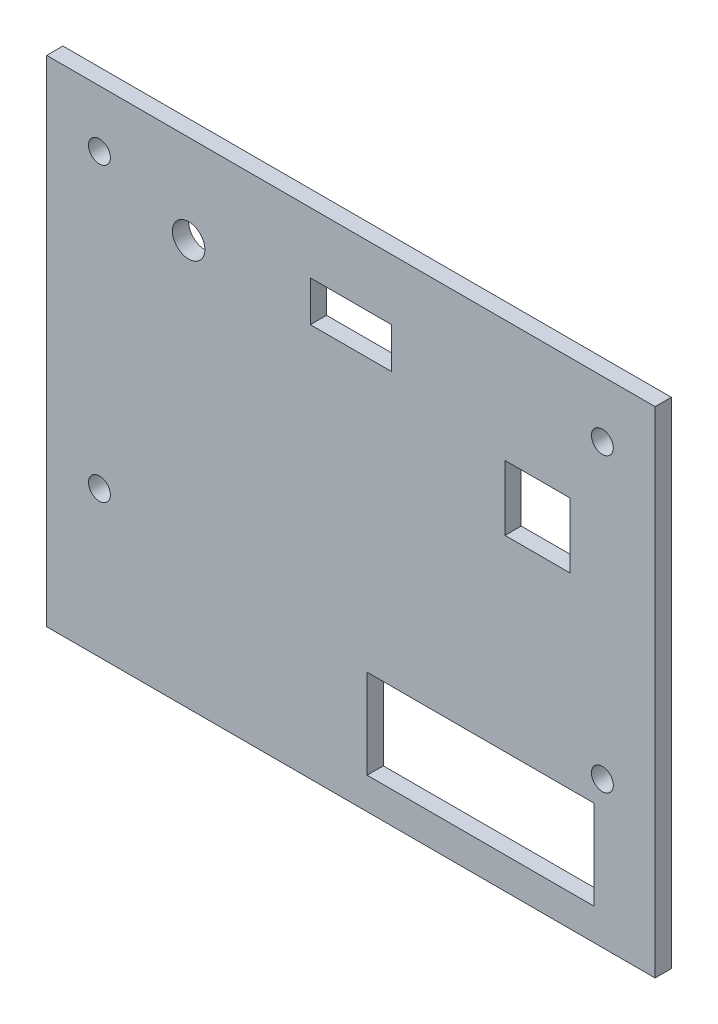
ISO-10303-21;
HEADER;
FILE_DESCRIPTION(('STEP AP214'),'2;1');
FILE_NAME('part.step','',(''),(''),'','','');
FILE_SCHEMA(('AUTOMOTIVE_DESIGN { 1 0 10303 214 1 1 1 1 }'));
ENDSEC;
DATA;
#1=APPLICATION_CONTEXT('core data for automotive mechanical design processes');
#2=APPLICATION_PROTOCOL_DEFINITION('international standard','automotive_design',2000,#1);
#3=PRODUCT_CONTEXT('',#1,'mechanical');
#4=PRODUCT('Part','Part','',(#3));
#5=PRODUCT_RELATED_PRODUCT_CATEGORY('part','',(#4));
#6=PRODUCT_DEFINITION_FORMATION('','',#4);
#7=PRODUCT_DEFINITION_CONTEXT('part definition',#1,'design');
#8=PRODUCT_DEFINITION('design','',#6,#7);
#9=PRODUCT_DEFINITION_SHAPE('','',#8);
#10=(LENGTH_UNIT() NAMED_UNIT(*) SI_UNIT(.MILLI.,.METRE.));
#11=(NAMED_UNIT(*) PLANE_ANGLE_UNIT() SI_UNIT($,.RADIAN.));
#12=(NAMED_UNIT(*) SI_UNIT($,.STERADIAN.) SOLID_ANGLE_UNIT());
#13=UNCERTAINTY_MEASURE_WITH_UNIT(LENGTH_MEASURE(1.E-05),#10,'distance_accuracy_value','');
#14=(GEOMETRIC_REPRESENTATION_CONTEXT(3) GLOBAL_UNCERTAINTY_ASSIGNED_CONTEXT((#13)) GLOBAL_UNIT_ASSIGNED_CONTEXT((#10,
#11,#12)) REPRESENTATION_CONTEXT('',''));
#15=CARTESIAN_POINT('',(0.,0.,0.));
#16=DIRECTION('',(0.,0.,1.));
#17=DIRECTION('',(1.,0.,0.));
#18=AXIS2_PLACEMENT_3D('',#15,#16,#17);
#19=CARTESIAN_POINT('',(0.,0.,2.));
#20=DIRECTION('',(0.,0.,-1.));
#21=DIRECTION('',(-1.,0.,0.));
#22=AXIS2_PLACEMENT_3D('',#19,#20,#21);
#23=PLANE('',#22);
#24=CARTESIAN_POINT('',(17.5,50.,2.));
#25=DIRECTION('',(0.,0.,1.));
#26=DIRECTION('',(1.,0.,0.));
#27=AXIS2_PLACEMENT_3D('',#24,#25,#26);
#28=CIRCLE('',#27,2.);
#29=CARTESIAN_POINT('',(19.5,50.,2.));
#30=VERTEX_POINT('',#29);
#31=EDGE_CURVE('E399',#30,#30,#28,.T.);
#32=ORIENTED_EDGE('',*,*,#31,.F.);
#33=EDGE_LOOP('',(#32));
#34=FACE_BOUND('',#33,.T.);
#35=CARTESIAN_POINT('',(68.5,18.,2.));
#36=DIRECTION('',(0.,0.,1.));
#37=DIRECTION('',(1.,0.,0.));
#38=AXIS2_PLACEMENT_3D('',#35,#36,#37);
#39=CIRCLE('',#38,1.35000000000001);
#40=CARTESIAN_POINT('',(69.85,18.,2.));
#41=VERTEX_POINT('',#40);
#42=EDGE_CURVE('E417',#41,#41,#39,.T.);
#43=ORIENTED_EDGE('',*,*,#42,.F.);
#44=EDGE_LOOP('',(#43));
#45=FACE_BOUND('',#44,.T.);
#46=CARTESIAN_POINT('',(6.5,54.,2.));
#47=DIRECTION('',(0.,0.,1.));
#48=DIRECTION('',(1.,0.,0.));
#49=AXIS2_PLACEMENT_3D('',#46,#47,#48);
#50=CIRCLE('',#49,1.35);
#51=CARTESIAN_POINT('',(7.85,54.,2.));
#52=VERTEX_POINT('',#51);
#53=EDGE_CURVE('E410',#52,#52,#50,.T.);
#54=ORIENTED_EDGE('',*,*,#53,.F.);
#55=EDGE_LOOP('',(#54));
#56=FACE_BOUND('',#55,.T.);
#57=CARTESIAN_POINT('',(68.5,54.,2.));
#58=DIRECTION('',(0.,0.,1.));
#59=DIRECTION('',(1.,0.,0.));
#60=AXIS2_PLACEMENT_3D('',#57,#58,#59);
#61=CIRCLE('',#60,1.35000000000001);
#62=CARTESIAN_POINT('',(69.85,54.,2.));
#63=VERTEX_POINT('',#62);
#64=EDGE_CURVE('E404',#63,#63,#61,.T.);
#65=ORIENTED_EDGE('',*,*,#64,.F.);
#66=EDGE_LOOP('',(#65));
#67=FACE_BOUND('',#66,.T.);
#68=CARTESIAN_POINT('',(6.5,18.,2.));
#69=DIRECTION('',(0.,0.,1.));
#70=DIRECTION('',(1.,0.,0.));
#71=AXIS2_PLACEMENT_3D('',#68,#69,#70);
#72=CIRCLE('',#71,1.35);
#73=CARTESIAN_POINT('',(7.85,18.,2.));
#74=VERTEX_POINT('',#73);
#75=EDGE_CURVE('E198',#74,#74,#72,.T.);
#76=ORIENTED_EDGE('',*,*,#75,.F.);
#77=EDGE_LOOP('',(#76));
#78=FACE_BOUND('',#77,.T.);
#79=DIRECTION('',(0.,-1.,0.));
#80=VECTOR('',#79,1.);
#81=CARTESIAN_POINT('',(56.5,38.,2.));
#82=LINE('',#81,#80);
#83=CARTESIAN_POINT('',(56.5,46.,2.));
#84=VERTEX_POINT('',#83);
#85=CARTESIAN_POINT('',(56.5,38.,2.));
#86=VERTEX_POINT('',#85);
#87=EDGE_CURVE('E209',#84,#86,#82,.T.);
#88=ORIENTED_EDGE('',*,*,#87,.F.);
#89=DIRECTION('',(-1.,0.,0.));
#90=VECTOR('',#89,1.);
#91=CARTESIAN_POINT('',(56.5,46.,2.));
#92=LINE('',#91,#90);
#93=CARTESIAN_POINT('',(64.5,46.,2.));
#94=VERTEX_POINT('',#93);
#95=EDGE_CURVE('E204',#94,#84,#92,.T.);
#96=ORIENTED_EDGE('',*,*,#95,.F.);
#97=DIRECTION('',(0.,1.,0.));
#98=VECTOR('',#97,1.);
#99=CARTESIAN_POINT('',(64.5,38.,2.));
#100=LINE('',#99,#98);
#101=CARTESIAN_POINT('',(64.5,38.,2.));
#102=VERTEX_POINT('',#101);
#103=EDGE_CURVE('E218',#102,#94,#100,.T.);
#104=ORIENTED_EDGE('',*,*,#103,.F.);
#105=DIRECTION('',(1.,0.,0.));
#106=VECTOR('',#105,1.);
#107=CARTESIAN_POINT('',(56.5,38.,2.));
#108=LINE('',#107,#106);
#109=EDGE_CURVE('E220',#86,#102,#108,.T.);
#110=ORIENTED_EDGE('',*,*,#109,.F.);
#111=EDGE_LOOP('',(#88,#96,#104,#110));
#112=FACE_BOUND('',#111,.T.);
#113=DIRECTION('',(0.,-1.,0.));
#114=VECTOR('',#113,1.);
#115=CARTESIAN_POINT('',(0.,0.,2.));
#116=LINE('',#115,#114);
#117=CARTESIAN_POINT('',(0.,61.,2.));
#118=VERTEX_POINT('',#117);
#119=CARTESIAN_POINT('',(0.,0.,2.));
#120=VERTEX_POINT('',#119);
#121=EDGE_CURVE('E254',#118,#120,#116,.T.);
#122=ORIENTED_EDGE('',*,*,#121,.T.);
#123=DIRECTION('',(1.,0.,0.));
#124=VECTOR('',#123,1.);
#125=CARTESIAN_POINT('',(0.,0.,2.));
#126=LINE('',#125,#124);
#127=CARTESIAN_POINT('',(75.,0.,2.));
#128=VERTEX_POINT('',#127);
#129=EDGE_CURVE('E257',#120,#128,#126,.T.);
#130=ORIENTED_EDGE('',*,*,#129,.T.);
#131=DIRECTION('',(0.,1.,0.));
#132=VECTOR('',#131,1.);
#133=CARTESIAN_POINT('',(75.,0.,2.));
#134=LINE('',#133,#132);
#135=CARTESIAN_POINT('',(75.,61.,2.));
#136=VERTEX_POINT('',#135);
#137=EDGE_CURVE('E260',#128,#136,#134,.T.);
#138=ORIENTED_EDGE('',*,*,#137,.T.);
#139=DIRECTION('',(-1.,0.,0.));
#140=VECTOR('',#139,1.);
#141=CARTESIAN_POINT('',(0.,61.,2.));
#142=LINE('',#141,#140);
#143=EDGE_CURVE('E262',#136,#118,#142,.T.);
#144=ORIENTED_EDGE('',*,*,#143,.T.);
#145=EDGE_LOOP('',(#122,#130,#138,#144));
#146=FACE_BOUND('',#145,.T.);
#147=DIRECTION('',(0.,-1.,0.));
#148=VECTOR('',#147,1.);
#149=CARTESIAN_POINT('',(39.5,3.9,2.));
#150=LINE('',#149,#148);
#151=CARTESIAN_POINT('',(39.5,14.9,2.));
#152=VERTEX_POINT('',#151);
#153=CARTESIAN_POINT('',(39.5,3.9,2.));
#154=VERTEX_POINT('',#153);
#155=EDGE_CURVE('E223',#152,#154,#150,.T.);
#156=ORIENTED_EDGE('',*,*,#155,.F.);
#157=DIRECTION('',(-1.,0.,0.));
#158=VECTOR('',#157,1.);
#159=CARTESIAN_POINT('',(39.5,14.9,2.));
#160=LINE('',#159,#158);
#161=CARTESIAN_POINT('',(67.5,14.9,2.));
#162=VERTEX_POINT('',#161);
#163=EDGE_CURVE('E231',#162,#152,#160,.T.);
#164=ORIENTED_EDGE('',*,*,#163,.F.);
#165=DIRECTION('',(0.,1.,0.));
#166=VECTOR('',#165,1.);
#167=CARTESIAN_POINT('',(67.5,3.9,2.));
#168=LINE('',#167,#166);
#169=CARTESIAN_POINT('',(67.5,3.9,2.));
#170=VERTEX_POINT('',#169);
#171=EDGE_CURVE('E228',#170,#162,#168,.T.);
#172=ORIENTED_EDGE('',*,*,#171,.F.);
#173=DIRECTION('',(1.,0.,0.));
#174=VECTOR('',#173,1.);
#175=CARTESIAN_POINT('',(39.5,3.9,2.));
#176=LINE('',#175,#174);
#177=EDGE_CURVE('E225',#154,#170,#176,.T.);
#178=ORIENTED_EDGE('',*,*,#177,.F.);
#179=EDGE_LOOP('',(#156,#164,#172,#178));
#180=FACE_BOUND('',#179,.T.);
#181=DIRECTION('',(0.,-1.,0.));
#182=VECTOR('',#181,1.);
#183=CARTESIAN_POINT('',(32.5,48.5,2.));
#184=LINE('',#183,#182);
#185=CARTESIAN_POINT('',(32.5,53.5,2.));
#186=VERTEX_POINT('',#185);
#187=CARTESIAN_POINT('',(32.5,48.5,2.));
#188=VERTEX_POINT('',#187);
#189=EDGE_CURVE('E153',#186,#188,#184,.T.);
#190=ORIENTED_EDGE('',*,*,#189,.F.);
#191=DIRECTION('',(-1.,0.,0.));
#192=VECTOR('',#191,1.);
#193=CARTESIAN_POINT('',(32.5,53.5,2.));
#194=LINE('',#193,#192);
#195=CARTESIAN_POINT('',(42.5,53.5,2.));
#196=VERTEX_POINT('',#195);
#197=EDGE_CURVE('E177',#196,#186,#194,.T.);
#198=ORIENTED_EDGE('',*,*,#197,.F.);
#199=DIRECTION('',(0.,1.,0.));
#200=VECTOR('',#199,1.);
#201=CARTESIAN_POINT('',(42.5,48.5,2.));
#202=LINE('',#201,#200);
#203=CARTESIAN_POINT('',(42.5,48.5,2.));
#204=VERTEX_POINT('',#203);
#205=EDGE_CURVE('E175',#204,#196,#202,.T.);
#206=ORIENTED_EDGE('',*,*,#205,.F.);
#207=DIRECTION('',(1.,0.,0.));
#208=VECTOR('',#207,1.);
#209=CARTESIAN_POINT('',(32.5,48.5,2.));
#210=LINE('',#209,#208);
#211=EDGE_CURVE('E163',#188,#204,#210,.T.);
#212=ORIENTED_EDGE('',*,*,#211,.F.);
#213=EDGE_LOOP('',(#190,#198,#206,#212));
#214=FACE_BOUND('',#213,.T.);
#215=ADVANCED_FACE('F39',(#34,#45,#56,#67,#78,#112,#146,#180,#214),#23,.F.);
#216=CARTESIAN_POINT('',(0.,0.,0.));
#217=DIRECTION('',(0.,0.,-1.));
#218=DIRECTION('',(-1.,0.,0.));
#219=AXIS2_PLACEMENT_3D('',#216,#217,#218);
#220=PLANE('',#219);
#221=CARTESIAN_POINT('',(17.5,50.,0.));
#222=DIRECTION('',(0.,0.,1.));
#223=DIRECTION('',(1.,0.,0.));
#224=AXIS2_PLACEMENT_3D('',#221,#222,#223);
#225=CIRCLE('',#224,2.);
#226=CARTESIAN_POINT('',(19.5,50.,0.));
#227=VERTEX_POINT('',#226);
#228=EDGE_CURVE('E402',#227,#227,#225,.T.);
#229=ORIENTED_EDGE('',*,*,#228,.T.);
#230=EDGE_LOOP('',(#229));
#231=FACE_BOUND('',#230,.T.);
#232=CARTESIAN_POINT('',(68.5,18.,0.));
#233=DIRECTION('',(0.,0.,1.));
#234=DIRECTION('',(1.,0.,0.));
#235=AXIS2_PLACEMENT_3D('',#232,#233,#234);
#236=CIRCLE('',#235,1.35000000000001);
#237=CARTESIAN_POINT('',(69.85,18.,0.));
#238=VERTEX_POINT('',#237);
#239=EDGE_CURVE('E413',#238,#238,#236,.T.);
#240=ORIENTED_EDGE('',*,*,#239,.T.);
#241=EDGE_LOOP('',(#240));
#242=FACE_BOUND('',#241,.T.);
#243=CARTESIAN_POINT('',(6.5,54.,0.));
#244=DIRECTION('',(0.,0.,1.));
#245=DIRECTION('',(1.,0.,0.));
#246=AXIS2_PLACEMENT_3D('',#243,#244,#245);
#247=CIRCLE('',#246,1.35);
#248=CARTESIAN_POINT('',(7.85,54.,0.));
#249=VERTEX_POINT('',#248);
#250=EDGE_CURVE('E420',#249,#249,#247,.T.);
#251=ORIENTED_EDGE('',*,*,#250,.T.);
#252=EDGE_LOOP('',(#251));
#253=FACE_BOUND('',#252,.T.);
#254=CARTESIAN_POINT('',(68.5,54.,0.));
#255=DIRECTION('',(0.,0.,1.));
#256=DIRECTION('',(1.,0.,0.));
#257=AXIS2_PLACEMENT_3D('',#254,#255,#256);
#258=CIRCLE('',#257,1.35000000000001);
#259=CARTESIAN_POINT('',(69.85,54.,0.));
#260=VERTEX_POINT('',#259);
#261=EDGE_CURVE('E407',#260,#260,#258,.T.);
#262=ORIENTED_EDGE('',*,*,#261,.T.);
#263=EDGE_LOOP('',(#262));
#264=FACE_BOUND('',#263,.T.);
#265=CARTESIAN_POINT('',(6.5,18.,0.));
#266=DIRECTION('',(0.,0.,1.));
#267=DIRECTION('',(1.,0.,0.));
#268=AXIS2_PLACEMENT_3D('',#265,#266,#267);
#269=CIRCLE('',#268,1.35);
#270=CARTESIAN_POINT('',(7.85,18.,0.));
#271=VERTEX_POINT('',#270);
#272=EDGE_CURVE('E416',#271,#271,#269,.T.);
#273=ORIENTED_EDGE('',*,*,#272,.T.);
#274=EDGE_LOOP('',(#273));
#275=FACE_BOUND('',#274,.T.);
#276=DIRECTION('',(0.,-1.,0.));
#277=VECTOR('',#276,1.);
#278=CARTESIAN_POINT('',(0.,0.,0.));
#279=LINE('',#278,#277);
#280=CARTESIAN_POINT('',(0.,61.,0.));
#281=VERTEX_POINT('',#280);
#282=CARTESIAN_POINT('',(0.,0.,0.));
#283=VERTEX_POINT('',#282);
#284=EDGE_CURVE('E253',#281,#283,#279,.T.);
#285=ORIENTED_EDGE('',*,*,#284,.F.);
#286=DIRECTION('',(-1.,0.,0.));
#287=VECTOR('',#286,1.);
#288=CARTESIAN_POINT('',(0.,61.,0.));
#289=LINE('',#288,#287);
#290=CARTESIAN_POINT('',(75.,61.,0.));
#291=VERTEX_POINT('',#290);
#292=EDGE_CURVE('E258',#291,#281,#289,.T.);
#293=ORIENTED_EDGE('',*,*,#292,.F.);
#294=DIRECTION('',(0.,1.,0.));
#295=VECTOR('',#294,1.);
#296=CARTESIAN_POINT('',(75.,0.,0.));
#297=LINE('',#296,#295);
#298=CARTESIAN_POINT('',(75.,0.,0.));
#299=VERTEX_POINT('',#298);
#300=EDGE_CURVE('E269',#299,#291,#297,.T.);
#301=ORIENTED_EDGE('',*,*,#300,.F.);
#302=DIRECTION('',(1.,0.,0.));
#303=VECTOR('',#302,1.);
#304=CARTESIAN_POINT('',(0.,0.,0.));
#305=LINE('',#304,#303);
#306=EDGE_CURVE('E267',#283,#299,#305,.T.);
#307=ORIENTED_EDGE('',*,*,#306,.F.);
#308=EDGE_LOOP('',(#285,#293,#301,#307));
#309=FACE_BOUND('',#308,.T.);
#310=DIRECTION('',(-1.,0.,0.));
#311=VECTOR('',#310,1.);
#312=CARTESIAN_POINT('',(39.5,14.9,0.));
#313=LINE('',#312,#311);
#314=CARTESIAN_POINT('',(67.5,14.9,0.));
#315=VERTEX_POINT('',#314);
#316=CARTESIAN_POINT('',(39.5,14.9,0.));
#317=VERTEX_POINT('',#316);
#318=EDGE_CURVE('E226',#315,#317,#313,.T.);
#319=ORIENTED_EDGE('',*,*,#318,.T.);
#320=DIRECTION('',(0.,-1.,0.));
#321=VECTOR('',#320,1.);
#322=CARTESIAN_POINT('',(39.5,3.9,0.));
#323=LINE('',#322,#321);
#324=CARTESIAN_POINT('',(39.5,3.9,0.));
#325=VERTEX_POINT('',#324);
#326=EDGE_CURVE('E171',#317,#325,#323,.T.);
#327=ORIENTED_EDGE('',*,*,#326,.T.);
#328=DIRECTION('',(1.,0.,0.));
#329=VECTOR('',#328,1.);
#330=CARTESIAN_POINT('',(39.5,3.9,0.));
#331=LINE('',#330,#329);
#332=CARTESIAN_POINT('',(67.5,3.9,0.));
#333=VERTEX_POINT('',#332);
#334=EDGE_CURVE('E236',#325,#333,#331,.T.);
#335=ORIENTED_EDGE('',*,*,#334,.T.);
#336=DIRECTION('',(0.,1.,0.));
#337=VECTOR('',#336,1.);
#338=CARTESIAN_POINT('',(67.5,3.9,0.));
#339=LINE('',#338,#337);
#340=EDGE_CURVE('E239',#333,#315,#339,.T.);
#341=ORIENTED_EDGE('',*,*,#340,.T.);
#342=EDGE_LOOP('',(#319,#327,#335,#341));
#343=FACE_BOUND('',#342,.T.);
#344=DIRECTION('',(-1.,0.,0.));
#345=VECTOR('',#344,1.);
#346=CARTESIAN_POINT('',(56.5,46.,0.));
#347=LINE('',#346,#345);
#348=CARTESIAN_POINT('',(64.5,46.,0.));
#349=VERTEX_POINT('',#348);
#350=CARTESIAN_POINT('',(56.5,46.,0.));
#351=VERTEX_POINT('',#350);
#352=EDGE_CURVE('E205',#349,#351,#347,.T.);
#353=ORIENTED_EDGE('',*,*,#352,.T.);
#354=DIRECTION('',(0.,-1.,0.));
#355=VECTOR('',#354,1.);
#356=CARTESIAN_POINT('',(56.5,38.,0.));
#357=LINE('',#356,#355);
#358=CARTESIAN_POINT('',(56.5,38.,0.));
#359=VERTEX_POINT('',#358);
#360=EDGE_CURVE('E184',#351,#359,#357,.T.);
#361=ORIENTED_EDGE('',*,*,#360,.T.);
#362=DIRECTION('',(1.,0.,0.));
#363=VECTOR('',#362,1.);
#364=CARTESIAN_POINT('',(56.5,38.,0.));
#365=LINE('',#364,#363);
#366=CARTESIAN_POINT('',(64.5,38.,0.));
#367=VERTEX_POINT('',#366);
#368=EDGE_CURVE('E212',#359,#367,#365,.T.);
#369=ORIENTED_EDGE('',*,*,#368,.T.);
#370=DIRECTION('',(0.,1.,0.));
#371=VECTOR('',#370,1.);
#372=CARTESIAN_POINT('',(64.5,38.,0.));
#373=LINE('',#372,#371);
#374=EDGE_CURVE('E208',#367,#349,#373,.T.);
#375=ORIENTED_EDGE('',*,*,#374,.T.);
#376=EDGE_LOOP('',(#353,#361,#369,#375));
#377=FACE_BOUND('',#376,.T.);
#378=DIRECTION('',(-1.,0.,0.));
#379=VECTOR('',#378,1.);
#380=CARTESIAN_POINT('',(32.5,53.5,0.));
#381=LINE('',#380,#379);
#382=CARTESIAN_POINT('',(42.5,53.5,0.));
#383=VERTEX_POINT('',#382);
#384=CARTESIAN_POINT('',(32.5,53.5,0.));
#385=VERTEX_POINT('',#384);
#386=EDGE_CURVE('E164',#383,#385,#381,.T.);
#387=ORIENTED_EDGE('',*,*,#386,.T.);
#388=DIRECTION('',(0.,-1.,0.));
#389=VECTOR('',#388,1.);
#390=CARTESIAN_POINT('',(32.5,48.5,0.));
#391=LINE('',#390,#389);
#392=CARTESIAN_POINT('',(32.5,48.5,0.));
#393=VERTEX_POINT('',#392);
#394=EDGE_CURVE('E182',#385,#393,#391,.T.);
#395=ORIENTED_EDGE('',*,*,#394,.T.);
#396=DIRECTION('',(1.,0.,0.));
#397=VECTOR('',#396,1.);
#398=CARTESIAN_POINT('',(32.5,48.5,0.));
#399=LINE('',#398,#397);
#400=CARTESIAN_POINT('',(42.5,48.5,0.));
#401=VERTEX_POINT('',#400);
#402=EDGE_CURVE('E170',#393,#401,#399,.T.);
#403=ORIENTED_EDGE('',*,*,#402,.T.);
#404=DIRECTION('',(0.,1.,0.));
#405=VECTOR('',#404,1.);
#406=CARTESIAN_POINT('',(42.5,48.5,0.));
#407=LINE('',#406,#405);
#408=EDGE_CURVE('E186',#401,#383,#407,.T.);
#409=ORIENTED_EDGE('',*,*,#408,.T.);
#410=EDGE_LOOP('',(#387,#395,#403,#409));
#411=FACE_BOUND('',#410,.T.);
#412=ADVANCED_FACE('F287',(#231,#242,#253,#264,#275,#309,#343,#377,#411),#220,.T.);
#413=CARTESIAN_POINT('',(0.,0.,2.));
#414=DIRECTION('',(1.,0.,0.));
#415=DIRECTION('',(0.,0.,-1.));
#416=AXIS2_PLACEMENT_3D('',#413,#414,#415);
#417=PLANE('',#416);
#418=ORIENTED_EDGE('',*,*,#284,.T.);
#419=DIRECTION('',(0.,0.,-1.));
#420=VECTOR('',#419,1.);
#421=CARTESIAN_POINT('',(0.,0.,2.));
#422=LINE('',#421,#420);
#423=EDGE_CURVE('E11',#120,#283,#422,.T.);
#424=ORIENTED_EDGE('',*,*,#423,.F.);
#425=ORIENTED_EDGE('',*,*,#121,.F.);
#426=DIRECTION('',(0.,0.,-1.));
#427=VECTOR('',#426,1.);
#428=CARTESIAN_POINT('',(0.,61.,2.));
#429=LINE('',#428,#427);
#430=EDGE_CURVE('E264',#118,#281,#429,.T.);
#431=ORIENTED_EDGE('',*,*,#430,.T.);
#432=EDGE_LOOP('',(#418,#424,#425,#431));
#433=FACE_BOUND('',#432,.T.);
#434=ADVANCED_FACE('F41',(#433),#417,.F.);
#435=CARTESIAN_POINT('',(0.,0.,2.));
#436=DIRECTION('',(0.,1.,0.));
#437=DIRECTION('',(0.,0.,1.));
#438=AXIS2_PLACEMENT_3D('',#435,#436,#437);
#439=PLANE('',#438);
#440=ORIENTED_EDGE('',*,*,#306,.T.);
#441=DIRECTION('',(0.,0.,-1.));
#442=VECTOR('',#441,1.);
#443=CARTESIAN_POINT('',(75.,0.,2.));
#444=LINE('',#443,#442);
#445=EDGE_CURVE('E47',#128,#299,#444,.T.);
#446=ORIENTED_EDGE('',*,*,#445,.F.);
#447=ORIENTED_EDGE('',*,*,#129,.F.);
#448=ORIENTED_EDGE('',*,*,#423,.T.);
#449=EDGE_LOOP('',(#440,#446,#447,#448));
#450=FACE_BOUND('',#449,.T.);
#451=ADVANCED_FACE('F298',(#450),#439,.F.);
#452=CARTESIAN_POINT('',(75.,0.,2.));
#453=DIRECTION('',(-1.,0.,0.));
#454=DIRECTION('',(0.,0.,1.));
#455=AXIS2_PLACEMENT_3D('',#452,#453,#454);
#456=PLANE('',#455);
#457=ORIENTED_EDGE('',*,*,#300,.T.);
#458=DIRECTION('',(0.,0.,-1.));
#459=VECTOR('',#458,1.);
#460=CARTESIAN_POINT('',(75.,61.,2.));
#461=LINE('',#460,#459);
#462=EDGE_CURVE('E274',#136,#291,#461,.T.);
#463=ORIENTED_EDGE('',*,*,#462,.F.);
#464=ORIENTED_EDGE('',*,*,#137,.F.);
#465=ORIENTED_EDGE('',*,*,#445,.T.);
#466=EDGE_LOOP('',(#457,#463,#464,#465));
#467=FACE_BOUND('',#466,.T.);
#468=ADVANCED_FACE('F281',(#467),#456,.F.);
#469=CARTESIAN_POINT('',(0.,61.,2.));
#470=DIRECTION('',(0.,-1.,0.));
#471=DIRECTION('',(0.,0.,-1.));
#472=AXIS2_PLACEMENT_3D('',#469,#470,#471);
#473=PLANE('',#472);
#474=ORIENTED_EDGE('',*,*,#292,.T.);
#475=ORIENTED_EDGE('',*,*,#430,.F.);
#476=ORIENTED_EDGE('',*,*,#143,.F.);
#477=ORIENTED_EDGE('',*,*,#462,.T.);
#478=EDGE_LOOP('',(#474,#475,#476,#477));
#479=FACE_BOUND('',#478,.T.);
#480=ADVANCED_FACE('F291',(#479),#473,.F.);
#481=CARTESIAN_POINT('',(39.5,3.9,2.));
#482=DIRECTION('',(1.,0.,0.));
#483=DIRECTION('',(0.,0.,-1.));
#484=AXIS2_PLACEMENT_3D('',#481,#482,#483);
#485=PLANE('',#484);
#486=ORIENTED_EDGE('',*,*,#326,.F.);
#487=DIRECTION('',(0.,0.,-1.));
#488=VECTOR('',#487,1.);
#489=CARTESIAN_POINT('',(39.5,14.9,2.));
#490=LINE('',#489,#488);
#491=EDGE_CURVE('E233',#152,#317,#490,.T.);
#492=ORIENTED_EDGE('',*,*,#491,.F.);
#493=ORIENTED_EDGE('',*,*,#155,.T.);
#494=DIRECTION('',(0.,0.,-1.));
#495=VECTOR('',#494,1.);
#496=CARTESIAN_POINT('',(39.5,3.9,2.));
#497=LINE('',#496,#495);
#498=EDGE_CURVE('E250',#154,#325,#497,.T.);
#499=ORIENTED_EDGE('',*,*,#498,.T.);
#500=EDGE_LOOP('',(#486,#492,#493,#499));
#501=FACE_BOUND('',#500,.T.);
#502=ADVANCED_FACE('F316',(#501),#485,.T.);
#503=CARTESIAN_POINT('',(39.5,3.9,2.));
#504=DIRECTION('',(0.,1.,0.));
#505=DIRECTION('',(0.,0.,1.));
#506=AXIS2_PLACEMENT_3D('',#503,#504,#505);
#507=PLANE('',#506);
#508=ORIENTED_EDGE('',*,*,#334,.F.);
#509=ORIENTED_EDGE('',*,*,#498,.F.);
#510=ORIENTED_EDGE('',*,*,#177,.T.);
#511=DIRECTION('',(0.,0.,-1.));
#512=VECTOR('',#511,1.);
#513=CARTESIAN_POINT('',(67.5,3.9,2.));
#514=LINE('',#513,#512);
#515=EDGE_CURVE('E248',#170,#333,#514,.T.);
#516=ORIENTED_EDGE('',*,*,#515,.T.);
#517=EDGE_LOOP('',(#508,#509,#510,#516));
#518=FACE_BOUND('',#517,.T.);
#519=ADVANCED_FACE('F323',(#518),#507,.T.);
#520=CARTESIAN_POINT('',(67.5,3.9,2.));
#521=DIRECTION('',(-1.,0.,0.));
#522=DIRECTION('',(0.,0.,1.));
#523=AXIS2_PLACEMENT_3D('',#520,#521,#522);
#524=PLANE('',#523);
#525=ORIENTED_EDGE('',*,*,#340,.F.);
#526=ORIENTED_EDGE('',*,*,#515,.F.);
#527=ORIENTED_EDGE('',*,*,#171,.T.);
#528=DIRECTION('',(0.,0.,-1.));
#529=VECTOR('',#528,1.);
#530=CARTESIAN_POINT('',(67.5,14.9,2.));
#531=LINE('',#530,#529);
#532=EDGE_CURVE('E246',#162,#315,#531,.T.);
#533=ORIENTED_EDGE('',*,*,#532,.T.);
#534=EDGE_LOOP('',(#525,#526,#527,#533));
#535=FACE_BOUND('',#534,.T.);
#536=ADVANCED_FACE('F328',(#535),#524,.T.);
#537=CARTESIAN_POINT('',(39.5,14.9,2.));
#538=DIRECTION('',(0.,-1.,0.));
#539=DIRECTION('',(0.,0.,-1.));
#540=AXIS2_PLACEMENT_3D('',#537,#538,#539);
#541=PLANE('',#540);
#542=ORIENTED_EDGE('',*,*,#318,.F.);
#543=ORIENTED_EDGE('',*,*,#532,.F.);
#544=ORIENTED_EDGE('',*,*,#163,.T.);
#545=ORIENTED_EDGE('',*,*,#491,.T.);
#546=EDGE_LOOP('',(#542,#543,#544,#545));
#547=FACE_BOUND('',#546,.T.);
#548=ADVANCED_FACE('F335',(#547),#541,.T.);
#549=CARTESIAN_POINT('',(56.5,38.,2.));
#550=DIRECTION('',(1.,0.,0.));
#551=DIRECTION('',(0.,0.,-1.));
#552=AXIS2_PLACEMENT_3D('',#549,#550,#551);
#553=PLANE('',#552);
#554=ORIENTED_EDGE('',*,*,#360,.F.);
#555=DIRECTION('',(0.,0.,-1.));
#556=VECTOR('',#555,1.);
#557=CARTESIAN_POINT('',(56.5,46.,2.));
#558=LINE('',#557,#556);
#559=EDGE_CURVE('E201',#84,#351,#558,.T.);
#560=ORIENTED_EDGE('',*,*,#559,.F.);
#561=ORIENTED_EDGE('',*,*,#87,.T.);
#562=DIRECTION('',(0.,0.,-1.));
#563=VECTOR('',#562,1.);
#564=CARTESIAN_POINT('',(56.5,38.,2.));
#565=LINE('',#564,#563);
#566=EDGE_CURVE('E194',#86,#359,#565,.T.);
#567=ORIENTED_EDGE('',*,*,#566,.T.);
#568=EDGE_LOOP('',(#554,#560,#561,#567));
#569=FACE_BOUND('',#568,.T.);
#570=ADVANCED_FACE('F348',(#569),#553,.T.);
#571=CARTESIAN_POINT('',(56.5,38.,2.));
#572=DIRECTION('',(0.,1.,0.));
#573=DIRECTION('',(0.,0.,1.));
#574=AXIS2_PLACEMENT_3D('',#571,#572,#573);
#575=PLANE('',#574);
#576=ORIENTED_EDGE('',*,*,#368,.F.);
#577=ORIENTED_EDGE('',*,*,#566,.F.);
#578=ORIENTED_EDGE('',*,*,#109,.T.);
#579=DIRECTION('',(0.,0.,-1.));
#580=VECTOR('',#579,1.);
#581=CARTESIAN_POINT('',(64.5,38.,2.));
#582=LINE('',#581,#580);
#583=EDGE_CURVE('E197',#102,#367,#582,.T.);
#584=ORIENTED_EDGE('',*,*,#583,.T.);
#585=EDGE_LOOP('',(#576,#577,#578,#584));
#586=FACE_BOUND('',#585,.T.);
#587=ADVANCED_FACE('F357',(#586),#575,.T.);
#588=CARTESIAN_POINT('',(64.5,38.,2.));
#589=DIRECTION('',(-1.,0.,0.));
#590=DIRECTION('',(0.,0.,1.));
#591=AXIS2_PLACEMENT_3D('',#588,#589,#590);
#592=PLANE('',#591);
#593=ORIENTED_EDGE('',*,*,#374,.F.);
#594=ORIENTED_EDGE('',*,*,#583,.F.);
#595=ORIENTED_EDGE('',*,*,#103,.T.);
#596=DIRECTION('',(0.,0.,-1.));
#597=VECTOR('',#596,1.);
#598=CARTESIAN_POINT('',(64.5,46.,2.));
#599=LINE('',#598,#597);
#600=EDGE_CURVE('E62',#94,#349,#599,.T.);
#601=ORIENTED_EDGE('',*,*,#600,.T.);
#602=EDGE_LOOP('',(#593,#594,#595,#601));
#603=FACE_BOUND('',#602,.T.);
#604=ADVANCED_FACE('F354',(#603),#592,.T.);
#605=CARTESIAN_POINT('',(56.5,46.,2.));
#606=DIRECTION('',(0.,-1.,0.));
#607=DIRECTION('',(0.,0.,-1.));
#608=AXIS2_PLACEMENT_3D('',#605,#606,#607);
#609=PLANE('',#608);
#610=ORIENTED_EDGE('',*,*,#352,.F.);
#611=ORIENTED_EDGE('',*,*,#600,.F.);
#612=ORIENTED_EDGE('',*,*,#95,.T.);
#613=ORIENTED_EDGE('',*,*,#559,.T.);
#614=EDGE_LOOP('',(#610,#611,#612,#613));
#615=FACE_BOUND('',#614,.T.);
#616=ADVANCED_FACE('F351',(#615),#609,.T.);
#617=CARTESIAN_POINT('',(32.5,48.5,2.));
#618=DIRECTION('',(1.,0.,0.));
#619=DIRECTION('',(0.,0.,-1.));
#620=AXIS2_PLACEMENT_3D('',#617,#618,#619);
#621=PLANE('',#620);
#622=ORIENTED_EDGE('',*,*,#394,.F.);
#623=DIRECTION('',(0.,0.,-1.));
#624=VECTOR('',#623,1.);
#625=CARTESIAN_POINT('',(32.5,53.5,2.));
#626=LINE('',#625,#624);
#627=EDGE_CURVE('E159',#186,#385,#626,.T.);
#628=ORIENTED_EDGE('',*,*,#627,.F.);
#629=ORIENTED_EDGE('',*,*,#189,.T.);
#630=DIRECTION('',(0.,0.,-1.));
#631=VECTOR('',#630,1.);
#632=CARTESIAN_POINT('',(32.5,48.5,2.));
#633=LINE('',#632,#631);
#634=EDGE_CURVE('E156',#188,#393,#633,.T.);
#635=ORIENTED_EDGE('',*,*,#634,.T.);
#636=EDGE_LOOP('',(#622,#628,#629,#635));
#637=FACE_BOUND('',#636,.T.);
#638=ADVANCED_FACE('F155',(#637),#621,.T.);
#639=CARTESIAN_POINT('',(32.5,48.5,2.));
#640=DIRECTION('',(0.,1.,0.));
#641=DIRECTION('',(0.,0.,1.));
#642=AXIS2_PLACEMENT_3D('',#639,#640,#641);
#643=PLANE('',#642);
#644=ORIENTED_EDGE('',*,*,#402,.F.);
#645=ORIENTED_EDGE('',*,*,#634,.F.);
#646=ORIENTED_EDGE('',*,*,#211,.T.);
#647=DIRECTION('',(0.,0.,-1.));
#648=VECTOR('',#647,1.);
#649=CARTESIAN_POINT('',(42.5,48.5,2.));
#650=LINE('',#649,#648);
#651=EDGE_CURVE('E172',#204,#401,#650,.T.);
#652=ORIENTED_EDGE('',*,*,#651,.T.);
#653=EDGE_LOOP('',(#644,#645,#646,#652));
#654=FACE_BOUND('',#653,.T.);
#655=ADVANCED_FACE('F167',(#654),#643,.T.);
#656=CARTESIAN_POINT('',(42.5,48.5,2.));
#657=DIRECTION('',(-1.,0.,0.));
#658=DIRECTION('',(0.,0.,1.));
#659=AXIS2_PLACEMENT_3D('',#656,#657,#658);
#660=PLANE('',#659);
#661=ORIENTED_EDGE('',*,*,#408,.F.);
#662=ORIENTED_EDGE('',*,*,#651,.F.);
#663=ORIENTED_EDGE('',*,*,#205,.T.);
#664=DIRECTION('',(0.,0.,-1.));
#665=VECTOR('',#664,1.);
#666=CARTESIAN_POINT('',(42.5,53.5,2.));
#667=LINE('',#666,#665);
#668=EDGE_CURVE('E54',#196,#383,#667,.T.);
#669=ORIENTED_EDGE('',*,*,#668,.T.);
#670=EDGE_LOOP('',(#661,#662,#663,#669));
#671=FACE_BOUND('',#670,.T.);
#672=ADVANCED_FACE('F369',(#671),#660,.T.);
#673=CARTESIAN_POINT('',(32.5,53.5,2.));
#674=DIRECTION('',(0.,-1.,0.));
#675=DIRECTION('',(0.,0.,-1.));
#676=AXIS2_PLACEMENT_3D('',#673,#674,#675);
#677=PLANE('',#676);
#678=ORIENTED_EDGE('',*,*,#386,.F.);
#679=ORIENTED_EDGE('',*,*,#668,.F.);
#680=ORIENTED_EDGE('',*,*,#197,.T.);
#681=ORIENTED_EDGE('',*,*,#627,.T.);
#682=EDGE_LOOP('',(#678,#679,#680,#681));
#683=FACE_BOUND('',#682,.T.);
#684=ADVANCED_FACE('F372',(#683),#677,.T.);
#685=CARTESIAN_POINT('',(6.5,18.,2.));
#686=DIRECTION('',(0.,0.,-1.));
#687=DIRECTION('',(-1.,0.,0.));
#688=AXIS2_PLACEMENT_3D('',#685,#686,#687);
#689=CYLINDRICAL_SURFACE('',#688,1.35);
#690=ORIENTED_EDGE('',*,*,#75,.T.);
#691=EDGE_LOOP('',(#690));
#692=FACE_BOUND('',#691,.T.);
#693=ORIENTED_EDGE('',*,*,#272,.F.);
#694=EDGE_LOOP('',(#693));
#695=FACE_BOUND('',#694,.T.);
#696=ADVANCED_FACE('F376',(#692,#695),#689,.F.);
#697=CARTESIAN_POINT('',(68.5,54.,2.));
#698=DIRECTION('',(0.,0.,-1.));
#699=DIRECTION('',(-1.,0.,0.));
#700=AXIS2_PLACEMENT_3D('',#697,#698,#699);
#701=CYLINDRICAL_SURFACE('',#700,1.35000000000001);
#702=ORIENTED_EDGE('',*,*,#64,.T.);
#703=EDGE_LOOP('',(#702));
#704=FACE_BOUND('',#703,.T.);
#705=ORIENTED_EDGE('',*,*,#261,.F.);
#706=EDGE_LOOP('',(#705));
#707=FACE_BOUND('',#706,.T.);
#708=ADVANCED_FACE('F379',(#704,#707),#701,.F.);
#709=CARTESIAN_POINT('',(6.5,54.,2.));
#710=DIRECTION('',(0.,0.,-1.));
#711=DIRECTION('',(-1.,0.,0.));
#712=AXIS2_PLACEMENT_3D('',#709,#710,#711);
#713=CYLINDRICAL_SURFACE('',#712,1.35);
#714=ORIENTED_EDGE('',*,*,#53,.T.);
#715=EDGE_LOOP('',(#714));
#716=FACE_BOUND('',#715,.T.);
#717=ORIENTED_EDGE('',*,*,#250,.F.);
#718=EDGE_LOOP('',(#717));
#719=FACE_BOUND('',#718,.T.);
#720=ADVANCED_FACE('F381',(#716,#719),#713,.F.);
#721=CARTESIAN_POINT('',(68.5,18.,2.));
#722=DIRECTION('',(0.,0.,-1.));
#723=DIRECTION('',(-1.,0.,0.));
#724=AXIS2_PLACEMENT_3D('',#721,#722,#723);
#725=CYLINDRICAL_SURFACE('',#724,1.35000000000001);
#726=ORIENTED_EDGE('',*,*,#42,.T.);
#727=EDGE_LOOP('',(#726));
#728=FACE_BOUND('',#727,.T.);
#729=ORIENTED_EDGE('',*,*,#239,.F.);
#730=EDGE_LOOP('',(#729));
#731=FACE_BOUND('',#730,.T.);
#732=ADVANCED_FACE('F384',(#728,#731),#725,.F.);
#733=CARTESIAN_POINT('',(17.5,50.,2.));
#734=DIRECTION('',(0.,0.,-1.));
#735=DIRECTION('',(-1.,0.,0.));
#736=AXIS2_PLACEMENT_3D('',#733,#734,#735);
#737=CYLINDRICAL_SURFACE('',#736,2.);
#738=ORIENTED_EDGE('',*,*,#31,.T.);
#739=EDGE_LOOP('',(#738));
#740=FACE_BOUND('',#739,.T.);
#741=ORIENTED_EDGE('',*,*,#228,.F.);
#742=EDGE_LOOP('',(#741));
#743=FACE_BOUND('',#742,.T.);
#744=ADVANCED_FACE('F388',(#740,#743),#737,.F.);
#745=CLOSED_SHELL('',(#215,#412,#434,#451,#468,#480,#502,#519,#536,#548,#570,#587,#604,#616,
#638,#655,#672,#684,#696,#708,#720,#732,#744));
#746=MANIFOLD_SOLID_BREP('B2',#745);
#747=ADVANCED_BREP_SHAPE_REPRESENTATION('',(#18,#746),#14);
#748=SHAPE_DEFINITION_REPRESENTATION(#9,#747);
ENDSEC;
END-ISO-10303-21;
